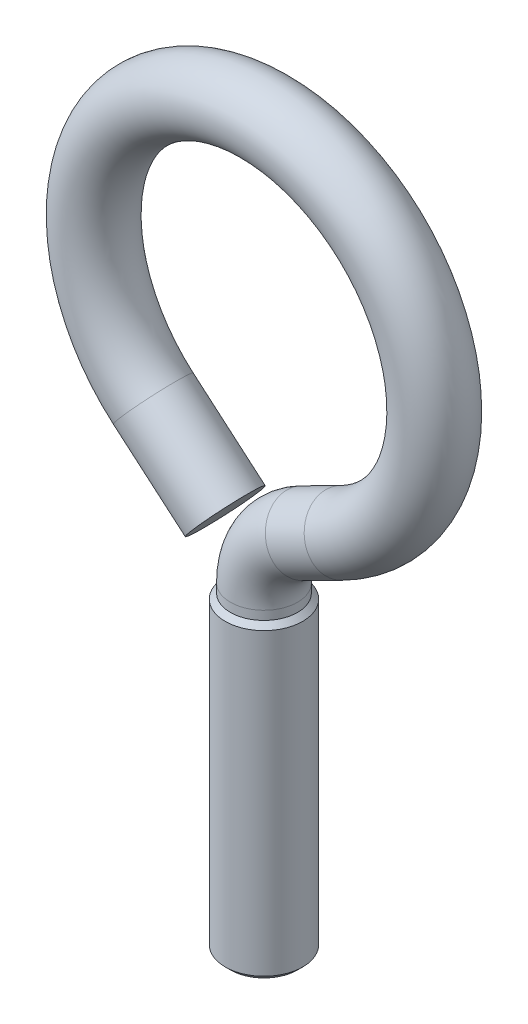
ISO-10303-21;
HEADER;
FILE_DESCRIPTION(('STEP AP214'),'2;1');
FILE_NAME('part.step','',(''),(''),'','','');
FILE_SCHEMA(('AUTOMOTIVE_DESIGN { 1 0 10303 214 1 1 1 1 }'));
ENDSEC;
DATA;
#1=APPLICATION_CONTEXT('core data for automotive mechanical design processes');
#2=APPLICATION_PROTOCOL_DEFINITION('international standard','automotive_design',2000,#1);
#3=PRODUCT_CONTEXT('',#1,'mechanical');
#4=PRODUCT('Part','Part','',(#3));
#5=PRODUCT_RELATED_PRODUCT_CATEGORY('part','',(#4));
#6=PRODUCT_DEFINITION_FORMATION('','',#4);
#7=PRODUCT_DEFINITION_CONTEXT('part definition',#1,'design');
#8=PRODUCT_DEFINITION('design','',#6,#7);
#9=PRODUCT_DEFINITION_SHAPE('','',#8);
#10=(LENGTH_UNIT() NAMED_UNIT(*) SI_UNIT(.MILLI.,.METRE.));
#11=(NAMED_UNIT(*) PLANE_ANGLE_UNIT() SI_UNIT($,.RADIAN.));
#12=(NAMED_UNIT(*) SI_UNIT($,.STERADIAN.) SOLID_ANGLE_UNIT());
#13=UNCERTAINTY_MEASURE_WITH_UNIT(LENGTH_MEASURE(1.E-05),#10,'distance_accuracy_value','');
#14=(GEOMETRIC_REPRESENTATION_CONTEXT(3) GLOBAL_UNCERTAINTY_ASSIGNED_CONTEXT((#13)) GLOBAL_UNIT_ASSIGNED_CONTEXT((#10,
#11,#12)) REPRESENTATION_CONTEXT('',''));
#15=CARTESIAN_POINT('',(0.,0.,0.));
#16=DIRECTION('',(0.,0.,1.));
#17=DIRECTION('',(1.,0.,0.));
#18=AXIS2_PLACEMENT_3D('',#15,#16,#17);
#19=CARTESIAN_POINT('',(0.,-12.,0.));
#20=DIRECTION('',(0.,1.,0.));
#21=DIRECTION('',(0.,0.,1.));
#22=AXIS2_PLACEMENT_3D('',#19,#20,#21);
#23=PLANE('',#22);
#24=CARTESIAN_POINT('',(0.,-12.,0.));
#25=DIRECTION('',(0.,1.,0.));
#26=DIRECTION('',(0.,0.,1.));
#27=AXIS2_PLACEMENT_3D('',#24,#25,#26);
#28=CIRCLE('',#27,1.3);
#29=CARTESIAN_POINT('',(0.,-12.,1.3));
#30=VERTEX_POINT('',#29);
#31=EDGE_CURVE('E10',#30,#30,#28,.F.);
#32=ORIENTED_EDGE('',*,*,#31,.T.);
#33=EDGE_LOOP('',(#32));
#34=FACE_BOUND('',#33,.T.);
#35=ADVANCED_FACE('F32',(#34),#23,.F.);
#36=CARTESIAN_POINT('',(0.,0.,0.));
#37=DIRECTION('',(0.,-1.,0.));
#38=DIRECTION('',(0.,0.,-1.));
#39=AXIS2_PLACEMENT_3D('',#36,#37,#38);
#40=CYLINDRICAL_SURFACE('',#39,1.5);
#41=CARTESIAN_POINT('',(0.,-0.200000000000006,0.));
#42=DIRECTION('',(0.,1.,0.));
#43=DIRECTION('',(0.,0.,1.));
#44=AXIS2_PLACEMENT_3D('',#41,#42,#43);
#45=CIRCLE('',#44,1.5);
#46=CARTESIAN_POINT('',(0.,-0.200000000000006,1.5));
#47=VERTEX_POINT('',#46);
#48=EDGE_CURVE('E40',#47,#47,#45,.F.);
#49=ORIENTED_EDGE('',*,*,#48,.T.);
#50=EDGE_LOOP('',(#49));
#51=FACE_BOUND('',#50,.T.);
#52=CARTESIAN_POINT('',(0.,-11.8,0.));
#53=DIRECTION('',(0.,1.,0.));
#54=DIRECTION('',(0.,0.,1.));
#55=AXIS2_PLACEMENT_3D('',#52,#53,#54);
#56=CIRCLE('',#55,1.5);
#57=CARTESIAN_POINT('',(0.,-11.8,1.5));
#58=VERTEX_POINT('',#57);
#59=EDGE_CURVE('E44',#58,#58,#56,.T.);
#60=ORIENTED_EDGE('',*,*,#59,.T.);
#61=EDGE_LOOP('',(#60));
#62=FACE_BOUND('',#61,.T.);
#63=ADVANCED_FACE('F83',(#51,#62),#40,.T.);
#64=CARTESIAN_POINT('',(-1.5,2.,0.));
#65=DIRECTION('',(0.760197575052313,-0.649691963075259,0.));
#66=DIRECTION('',(0.,0.,1.));
#67=AXIS2_PLACEMENT_3D('',#64,#65,#66);
#68=PLANE('',#67);
#69=CARTESIAN_POINT('',(-1.5,2.,0.));
#70=DIRECTION('',(0.760197575052313,-0.649691963075259,0.));
#71=DIRECTION('',(0.,0.,1.));
#72=AXIS2_PLACEMENT_3D('',#69,#70,#71);
#73=CIRCLE('',#72,1.3);
#74=CARTESIAN_POINT('',(-1.5,2.,1.3));
#75=VERTEX_POINT('',#74);
#76=EDGE_CURVE('E65',#75,#75,#73,.T.);
#77=ORIENTED_EDGE('',*,*,#76,.T.);
#78=EDGE_LOOP('',(#77));
#79=FACE_BOUND('',#78,.T.);
#80=ADVANCED_FACE('F69',(#79),#68,.T.);
#81=CARTESIAN_POINT('',(-1.5,2.,0.));
#82=DIRECTION('',(-0.760197575052313,0.649691963075259,0.));
#83=DIRECTION('',(-0.649691963075259,-0.760197575052313,0.));
#84=AXIS2_PLACEMENT_3D('',#81,#82,#83);
#85=CYLINDRICAL_SURFACE('',#84,1.3);
#86=CARTESIAN_POINT('',(-4.28796695629672,4.38269600465474,0.));
#87=DIRECTION('',(0.760197575052313,-0.649691963075259,0.));
#88=DIRECTION('',(0.,0.,1.));
#89=AXIS2_PLACEMENT_3D('',#86,#87,#88);
#90=CIRCLE('',#89,1.3);
#91=CARTESIAN_POINT('',(-5.13256650829456,3.39443915708674,0.));
#92=VERTEX_POINT('',#91);
#93=EDGE_CURVE('E62',#92,#92,#90,.T.);
#94=ORIENTED_EDGE('',*,*,#93,.T.);
#95=EDGE_LOOP('',(#94));
#96=FACE_BOUND('',#95,.T.);
#97=ORIENTED_EDGE('',*,*,#76,.F.);
#98=EDGE_LOOP('',(#97));
#99=FACE_BOUND('',#98,.T.);
#100=ADVANCED_FACE('F71',(#96,#99),#85,.T.);
#101=CARTESIAN_POINT('',(0.,9.4,0.));
#102=DIRECTION('',(0.,0.,-1.));
#103=DIRECTION('',(-1.,0.,0.));
#104=AXIS2_PLACEMENT_3D('',#101,#102,#103);
#105=TOROIDAL_SURFACE('',#104,6.6,1.3);
#106=CARTESIAN_POINT('',(2.98484117574319,3.51351351351351,0.));
#107=DIRECTION('',(0.891891891891892,0.452248662991392,0.));
#108=DIRECTION('',(0.,0.,1.));
#109=AXIS2_PLACEMENT_3D('',#106,#107,#108);
#110=CIRCLE('',#109,1.3);
#111=CARTESIAN_POINT('',(3.572764437632,2.35405405405405,0.));
#112=VERTEX_POINT('',#111);
#113=EDGE_CURVE('E59',#112,#112,#110,.T.);
#114=CARTESIAN_POINT('',(0.,9.4,0.));
#115=DIRECTION('',(0.,0.,-1.));
#116=DIRECTION('',(-1.,0.,0.));
#117=AXIS2_PLACEMENT_3D('',#114,#115,#116);
#118=CIRCLE('',#117,7.9);
#119=EDGE_CURVE('',#92,#112,#118,.T.);
#120=ORIENTED_EDGE('',*,*,#93,.F.);
#121=ORIENTED_EDGE('',*,*,#113,.T.);
#122=ORIENTED_EDGE('',*,*,#119,.T.);
#123=ORIENTED_EDGE('',*,*,#119,.F.);
#124=EDGE_LOOP('',(#120,#122,#121,#123));
#125=FACE_BOUND('',#124,.T.);
#126=ADVANCED_FACE('F73',(#125),#105,.T.);
#127=CARTESIAN_POINT('',(2.98484117574319,3.51351351351352,0.));
#128=DIRECTION('',(-0.891891891891891,-0.452248662991393,0.));
#129=DIRECTION('',(0.452248662991393,-0.891891891891891,0.));
#130=AXIS2_PLACEMENT_3D('',#127,#128,#129);
#131=CYLINDRICAL_SURFACE('',#130,1.3);
#132=CARTESIAN_POINT('',(1.47892860992324,2.74991542425478,0.));
#133=DIRECTION('',(0.891891891891891,0.452248662991393,0.));
#134=DIRECTION('',(0.,0.,1.));
#135=AXIS2_PLACEMENT_3D('',#132,#133,#134);
#136=CIRCLE('',#135,1.3);
#137=CARTESIAN_POINT('',(0.891005348034431,3.90937488371424,0.));
#138=VERTEX_POINT('',#137);
#139=EDGE_CURVE('E56',#138,#138,#136,.T.);
#140=ORIENTED_EDGE('',*,*,#139,.T.);
#141=EDGE_LOOP('',(#140));
#142=FACE_BOUND('',#141,.T.);
#143=ORIENTED_EDGE('',*,*,#113,.F.);
#144=EDGE_LOOP('',(#143));
#145=FACE_BOUND('',#144,.T.);
#146=ADVANCED_FACE('F80',(#142,#145),#131,.T.);
#147=CARTESIAN_POINT('',(2.7,0.34180731614667,0.));
#148=DIRECTION('',(0.,0.,1.));
#149=DIRECTION('',(1.,0.,0.));
#150=AXIS2_PLACEMENT_3D('',#147,#148,#149);
#151=TOROIDAL_SURFACE('',#150,2.7,1.3);
#152=CARTESIAN_POINT('',(0.,0.34180731614667,0.));
#153=DIRECTION('',(0.,1.,0.));
#154=DIRECTION('',(0.,0.,1.));
#155=AXIS2_PLACEMENT_3D('',#152,#153,#154);
#156=CIRCLE('',#155,1.3);
#157=CARTESIAN_POINT('',(-1.3,0.34180731614667,0.));
#158=VERTEX_POINT('',#157);
#159=EDGE_CURVE('E53',#158,#158,#156,.T.);
#160=CARTESIAN_POINT('',(2.7,0.34180731614667,0.));
#161=DIRECTION('',(0.,0.,1.));
#162=DIRECTION('',(1.,0.,0.));
#163=AXIS2_PLACEMENT_3D('',#160,#161,#162);
#164=CIRCLE('',#163,4.);
#165=EDGE_CURVE('',#138,#158,#164,.T.);
#166=ORIENTED_EDGE('',*,*,#139,.F.);
#167=ORIENTED_EDGE('',*,*,#159,.T.);
#168=ORIENTED_EDGE('',*,*,#165,.T.);
#169=ORIENTED_EDGE('',*,*,#165,.F.);
#170=EDGE_LOOP('',(#166,#168,#167,#169));
#171=FACE_BOUND('',#170,.T.);
#172=ADVANCED_FACE('F105',(#171),#151,.T.);
#173=CARTESIAN_POINT('',(0.,0.34180731614667,0.));
#174=DIRECTION('',(0.,-1.,0.));
#175=DIRECTION('',(1.,0.,0.));
#176=AXIS2_PLACEMENT_3D('',#173,#174,#175);
#177=CYLINDRICAL_SURFACE('',#176,1.3);
#178=CARTESIAN_POINT('',(0.,0.,0.));
#179=DIRECTION('',(0.,1.,0.));
#180=DIRECTION('',(0.,0.,1.));
#181=AXIS2_PLACEMENT_3D('',#178,#179,#180);
#182=CIRCLE('',#181,1.3);
#183=CARTESIAN_POINT('',(0.,0.,1.3));
#184=VERTEX_POINT('',#183);
#185=EDGE_CURVE('E48',#184,#184,#182,.T.);
#186=ORIENTED_EDGE('',*,*,#185,.T.);
#187=EDGE_LOOP('',(#186));
#188=FACE_BOUND('',#187,.T.);
#189=ORIENTED_EDGE('',*,*,#159,.F.);
#190=EDGE_LOOP('',(#189));
#191=FACE_BOUND('',#190,.T.);
#192=ADVANCED_FACE('F92',(#188,#191),#177,.T.);
#193=CARTESIAN_POINT('',(0.,0.,0.));
#194=DIRECTION('',(0.,-1.,0.));
#195=DIRECTION('',(0.,0.,-1.));
#196=AXIS2_PLACEMENT_3D('',#193,#194,#195);
#197=CONICAL_SURFACE('',#196,1.3,0.785398163397445);
#198=ORIENTED_EDGE('',*,*,#48,.F.);
#199=EDGE_LOOP('',(#198));
#200=FACE_BOUND('',#199,.T.);
#201=ORIENTED_EDGE('',*,*,#185,.F.);
#202=EDGE_LOOP('',(#201));
#203=FACE_BOUND('',#202,.T.);
#204=ADVANCED_FACE('F85',(#200,#203),#197,.T.);
#205=CARTESIAN_POINT('',(0.,-11.8,0.));
#206=DIRECTION('',(0.,1.,0.));
#207=DIRECTION('',(0.,0.,1.));
#208=AXIS2_PLACEMENT_3D('',#205,#206,#207);
#209=CONICAL_SURFACE('',#208,1.5,0.785398163397446);
#210=ORIENTED_EDGE('',*,*,#31,.F.);
#211=EDGE_LOOP('',(#210));
#212=FACE_BOUND('',#211,.T.);
#213=ORIENTED_EDGE('',*,*,#59,.F.);
#214=EDGE_LOOP('',(#213));
#215=FACE_BOUND('',#214,.T.);
#216=ADVANCED_FACE('F35',(#212,#215),#209,.T.);
#217=CLOSED_SHELL('',(#35,#63,#80,#100,#126,#146,#172,#192,#204,#216));
#218=MANIFOLD_SOLID_BREP('B2',#217);
#219=ADVANCED_BREP_SHAPE_REPRESENTATION('',(#18,#218),#14);
#220=SHAPE_DEFINITION_REPRESENTATION(#9,#219);
ENDSEC;
END-ISO-10303-21;
